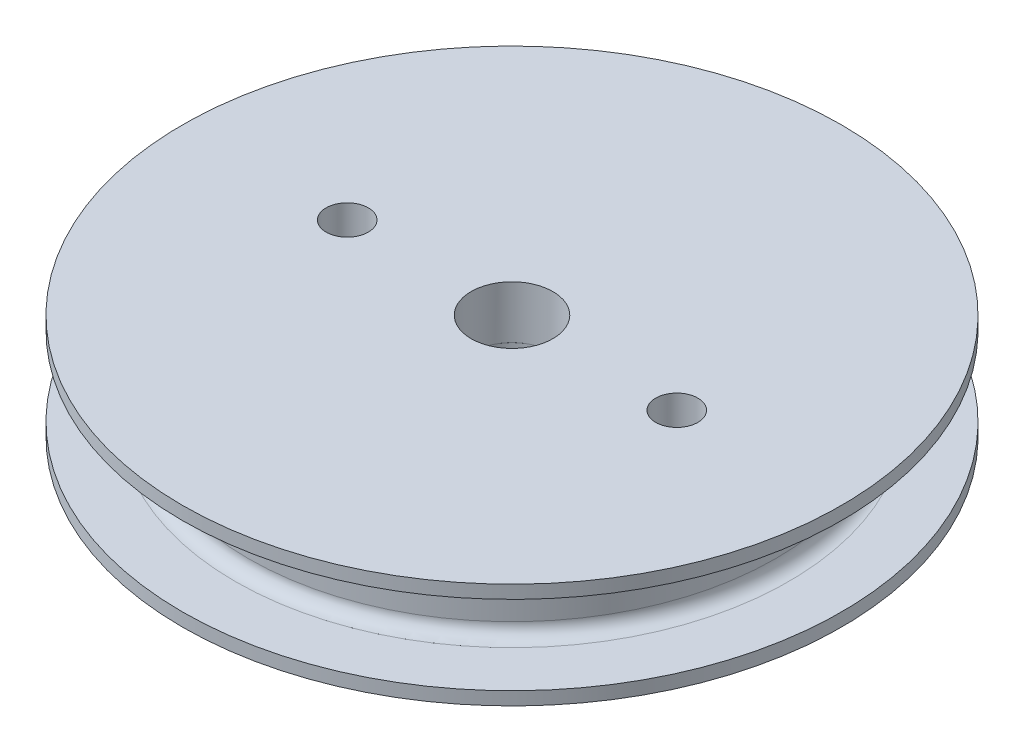
ISO-10303-21;
HEADER;
FILE_DESCRIPTION(('STEP AP214'),'2;1');
FILE_NAME('part.step','',(''),(''),'','','');
FILE_SCHEMA(('AUTOMOTIVE_DESIGN { 1 0 10303 214 1 1 1 1 }'));
ENDSEC;
DATA;
#1=APPLICATION_CONTEXT('core data for automotive mechanical design processes');
#2=APPLICATION_PROTOCOL_DEFINITION('international standard','automotive_design',2000,#1);
#3=PRODUCT_CONTEXT('',#1,'mechanical');
#4=PRODUCT('Part','Part','',(#3));
#5=PRODUCT_RELATED_PRODUCT_CATEGORY('part','',(#4));
#6=PRODUCT_DEFINITION_FORMATION('','',#4);
#7=PRODUCT_DEFINITION_CONTEXT('part definition',#1,'design');
#8=PRODUCT_DEFINITION('design','',#6,#7);
#9=PRODUCT_DEFINITION_SHAPE('','',#8);
#10=(LENGTH_UNIT() NAMED_UNIT(*) SI_UNIT(.MILLI.,.METRE.));
#11=(NAMED_UNIT(*) PLANE_ANGLE_UNIT() SI_UNIT($,.RADIAN.));
#12=(NAMED_UNIT(*) SI_UNIT($,.STERADIAN.) SOLID_ANGLE_UNIT());
#13=UNCERTAINTY_MEASURE_WITH_UNIT(LENGTH_MEASURE(1.E-05),#10,'distance_accuracy_value','');
#14=(GEOMETRIC_REPRESENTATION_CONTEXT(3) GLOBAL_UNCERTAINTY_ASSIGNED_CONTEXT((#13)) GLOBAL_UNIT_ASSIGNED_CONTEXT((#10,
#11,#12)) REPRESENTATION_CONTEXT('',''));
#15=CARTESIAN_POINT('',(0.,0.,0.));
#16=DIRECTION('',(0.,0.,1.));
#17=DIRECTION('',(1.,0.,0.));
#18=AXIS2_PLACEMENT_3D('',#15,#16,#17);
#19=CARTESIAN_POINT('',(25.,8.,0.));
#20=DIRECTION('',(0.,1.,0.));
#21=DIRECTION('',(0.,0.,-1.));
#22=AXIS2_PLACEMENT_3D('',#19,#20,#21);
#23=PLANE('',#22);
#24=CARTESIAN_POINT('',(12.5,8.,0.));
#25=DIRECTION('',(0.,-1.,0.));
#26=DIRECTION('',(0.,0.,-1.));
#27=AXIS2_PLACEMENT_3D('',#24,#25,#26);
#28=CIRCLE('',#27,1.6);
#29=CARTESIAN_POINT('',(12.5,8.,-1.6));
#30=VERTEX_POINT('',#29);
#31=EDGE_CURVE('E63',#30,#30,#28,.T.);
#32=ORIENTED_EDGE('',*,*,#31,.T.);
#33=EDGE_LOOP('',(#32));
#34=FACE_BOUND('',#33,.T.);
#35=CARTESIAN_POINT('',(-12.5,8.,0.));
#36=DIRECTION('',(0.,-1.,0.));
#37=DIRECTION('',(0.,0.,-1.));
#38=AXIS2_PLACEMENT_3D('',#35,#36,#37);
#39=CIRCLE('',#38,1.6);
#40=CARTESIAN_POINT('',(-12.5,8.,-1.6));
#41=VERTEX_POINT('',#40);
#42=EDGE_CURVE('E68',#41,#41,#39,.T.);
#43=ORIENTED_EDGE('',*,*,#42,.T.);
#44=EDGE_LOOP('',(#43));
#45=FACE_BOUND('',#44,.T.);
#46=CARTESIAN_POINT('',(0.,8.,0.));
#47=DIRECTION('',(0.,1.,0.));
#48=DIRECTION('',(0.,0.,1.));
#49=AXIS2_PLACEMENT_3D('',#46,#47,#48);
#50=CIRCLE('',#49,3.1);
#51=CARTESIAN_POINT('',(0.,8.,3.1));
#52=VERTEX_POINT('',#51);
#53=EDGE_CURVE('E60',#52,#52,#50,.T.);
#54=ORIENTED_EDGE('',*,*,#53,.F.);
#55=EDGE_LOOP('',(#54));
#56=FACE_BOUND('',#55,.T.);
#57=CARTESIAN_POINT('',(0.,8.,0.));
#58=DIRECTION('',(0.,-1.,0.));
#59=DIRECTION('',(0.,0.,-1.));
#60=AXIS2_PLACEMENT_3D('',#57,#58,#59);
#61=CIRCLE('',#60,25.);
#62=CARTESIAN_POINT('',(0.,8.,-25.));
#63=VERTEX_POINT('',#62);
#64=EDGE_CURVE('E11',#63,#63,#61,.T.);
#65=ORIENTED_EDGE('',*,*,#64,.F.);
#66=EDGE_LOOP('',(#65));
#67=FACE_BOUND('',#66,.T.);
#68=ADVANCED_FACE('F41',(#34,#45,#56,#67),#23,.T.);
#69=CARTESIAN_POINT('',(0.,8.,0.));
#70=DIRECTION('',(0.,1.,0.));
#71=DIRECTION('',(0.,0.,-1.));
#72=AXIS2_PLACEMENT_3D('',#69,#70,#71);
#73=CYLINDRICAL_SURFACE('',#72,25.);
#74=CARTESIAN_POINT('',(0.,7.,0.));
#75=DIRECTION('',(0.,-1.,0.));
#76=DIRECTION('',(0.,0.,-1.));
#77=AXIS2_PLACEMENT_3D('',#74,#75,#76);
#78=CIRCLE('',#77,25.);
#79=CARTESIAN_POINT('',(0.,7.,-25.));
#80=VERTEX_POINT('',#79);
#81=EDGE_CURVE('E48',#80,#80,#78,.T.);
#82=ORIENTED_EDGE('',*,*,#81,.F.);
#83=EDGE_LOOP('',(#82));
#84=FACE_BOUND('',#83,.T.);
#85=ORIENTED_EDGE('',*,*,#64,.T.);
#86=EDGE_LOOP('',(#85));
#87=FACE_BOUND('',#86,.T.);
#88=ADVANCED_FACE('F89',(#84,#87),#73,.T.);
#89=CARTESIAN_POINT('',(21.,7.,0.));
#90=DIRECTION('',(0.,-1.,0.));
#91=DIRECTION('',(0.,0.,1.));
#92=AXIS2_PLACEMENT_3D('',#89,#90,#91);
#93=PLANE('',#92);
#94=CARTESIAN_POINT('',(0.,7.,0.));
#95=DIRECTION('',(0.,-1.,0.));
#96=DIRECTION('',(0.,0.,-1.));
#97=AXIS2_PLACEMENT_3D('',#94,#95,#96);
#98=CIRCLE('',#97,21.);
#99=CARTESIAN_POINT('',(0.,7.,-21.));
#100=VERTEX_POINT('',#99);
#101=EDGE_CURVE('E53',#100,#100,#98,.T.);
#102=ORIENTED_EDGE('',*,*,#101,.F.);
#103=EDGE_LOOP('',(#102));
#104=FACE_BOUND('',#103,.T.);
#105=ORIENTED_EDGE('',*,*,#81,.T.);
#106=EDGE_LOOP('',(#105));
#107=FACE_BOUND('',#106,.T.);
#108=ADVANCED_FACE('F86',(#104,#107),#93,.T.);
#109=CARTESIAN_POINT('',(0.,6.,0.));
#110=DIRECTION('',(0.,1.,0.));
#111=DIRECTION('',(0.,0.,-1.));
#112=AXIS2_PLACEMENT_3D('',#109,#110,#111);
#113=TOROIDAL_SURFACE('',#112,21.,1.);
#114=CARTESIAN_POINT('',(0.,6.,0.));
#115=DIRECTION('',(0.,-1.,0.));
#116=DIRECTION('',(0.,0.,-1.));
#117=AXIS2_PLACEMENT_3D('',#114,#115,#116);
#118=CIRCLE('',#117,20.);
#119=CARTESIAN_POINT('',(0.,6.,-20.));
#120=VERTEX_POINT('',#119);
#121=EDGE_CURVE('E79',#120,#120,#118,.T.);
#122=ORIENTED_EDGE('',*,*,#121,.F.);
#123=EDGE_LOOP('',(#122));
#124=FACE_BOUND('',#123,.T.);
#125=ORIENTED_EDGE('',*,*,#101,.T.);
#126=EDGE_LOOP('',(#125));
#127=FACE_BOUND('',#126,.T.);
#128=ADVANCED_FACE('F84',(#124,#127),#113,.F.);
#129=CARTESIAN_POINT('',(0.,8.,0.));
#130=DIRECTION('',(0.,1.,0.));
#131=DIRECTION('',(0.,0.,-1.));
#132=AXIS2_PLACEMENT_3D('',#129,#130,#131);
#133=CYLINDRICAL_SURFACE('',#132,20.);
#134=CARTESIAN_POINT('',(0.,4.,0.));
#135=DIRECTION('',(0.,-1.,0.));
#136=DIRECTION('',(0.,0.,-1.));
#137=AXIS2_PLACEMENT_3D('',#134,#135,#136);
#138=CIRCLE('',#137,20.);
#139=CARTESIAN_POINT('',(0.,4.,-20.));
#140=VERTEX_POINT('',#139);
#141=EDGE_CURVE('E59',#140,#140,#138,.T.);
#142=ORIENTED_EDGE('',*,*,#141,.F.);
#143=EDGE_LOOP('',(#142));
#144=FACE_BOUND('',#143,.T.);
#145=ORIENTED_EDGE('',*,*,#121,.T.);
#146=EDGE_LOOP('',(#145));
#147=FACE_BOUND('',#146,.T.);
#148=ADVANCED_FACE('F101',(#144,#147),#133,.T.);
#149=CARTESIAN_POINT('',(0.,3.99999999999999,0.));
#150=DIRECTION('',(0.,-1.,0.));
#151=DIRECTION('',(0.,0.,1.));
#152=AXIS2_PLACEMENT_3D('',#149,#150,#151);
#153=PLANE('',#152);
#154=CARTESIAN_POINT('',(12.5,3.99999999999999,0.));
#155=DIRECTION('',(0.,-1.,0.));
#156=DIRECTION('',(0.,0.,-1.));
#157=AXIS2_PLACEMENT_3D('',#154,#155,#156);
#158=CIRCLE('',#157,1.6);
#159=CARTESIAN_POINT('',(12.5,3.99999999999999,-1.6));
#160=VERTEX_POINT('',#159);
#161=EDGE_CURVE('E44',#160,#160,#158,.T.);
#162=ORIENTED_EDGE('',*,*,#161,.F.);
#163=EDGE_LOOP('',(#162));
#164=FACE_BOUND('',#163,.T.);
#165=CARTESIAN_POINT('',(-12.5,3.99999999999999,0.));
#166=DIRECTION('',(0.,-1.,0.));
#167=DIRECTION('',(0.,0.,-1.));
#168=AXIS2_PLACEMENT_3D('',#165,#166,#167);
#169=CIRCLE('',#168,1.6);
#170=CARTESIAN_POINT('',(-12.5,3.99999999999999,-1.6));
#171=VERTEX_POINT('',#170);
#172=EDGE_CURVE('E61',#171,#171,#169,.T.);
#173=ORIENTED_EDGE('',*,*,#172,.F.);
#174=EDGE_LOOP('',(#173));
#175=FACE_BOUND('',#174,.T.);
#176=CARTESIAN_POINT('',(0.,3.99999999999999,0.));
#177=DIRECTION('',(0.,-1.,0.));
#178=DIRECTION('',(0.,0.,-1.));
#179=AXIS2_PLACEMENT_3D('',#176,#177,#178);
#180=CIRCLE('',#179,3.1);
#181=CARTESIAN_POINT('',(0.,3.99999999999999,-3.1));
#182=VERTEX_POINT('',#181);
#183=EDGE_CURVE('E57',#182,#182,#180,.T.);
#184=ORIENTED_EDGE('',*,*,#183,.F.);
#185=EDGE_LOOP('',(#184));
#186=FACE_BOUND('',#185,.T.);
#187=ORIENTED_EDGE('',*,*,#141,.T.);
#188=EDGE_LOOP('',(#187));
#189=FACE_BOUND('',#188,.T.);
#190=ADVANCED_FACE('F105',(#164,#175,#186,#189),#153,.T.);
#191=CARTESIAN_POINT('',(0.,0.,0.));
#192=DIRECTION('',(0.,1.,0.));
#193=DIRECTION('',(0.,0.,1.));
#194=AXIS2_PLACEMENT_3D('',#191,#192,#193);
#195=CYLINDRICAL_SURFACE('',#194,3.1);
#196=ORIENTED_EDGE('',*,*,#183,.T.);
#197=EDGE_LOOP('',(#196));
#198=FACE_BOUND('',#197,.T.);
#199=ORIENTED_EDGE('',*,*,#53,.T.);
#200=EDGE_LOOP('',(#199));
#201=FACE_BOUND('',#200,.T.);
#202=ADVANCED_FACE('F109',(#198,#201),#195,.F.);
#203=CARTESIAN_POINT('',(-12.5,8.,0.));
#204=DIRECTION('',(0.,-1.,0.));
#205=DIRECTION('',(0.,0.,-1.));
#206=AXIS2_PLACEMENT_3D('',#203,#204,#205);
#207=CYLINDRICAL_SURFACE('',#206,1.6);
#208=ORIENTED_EDGE('',*,*,#172,.T.);
#209=EDGE_LOOP('',(#208));
#210=FACE_BOUND('',#209,.T.);
#211=ORIENTED_EDGE('',*,*,#42,.F.);
#212=EDGE_LOOP('',(#211));
#213=FACE_BOUND('',#212,.T.);
#214=ADVANCED_FACE('F113',(#210,#213),#207,.F.);
#215=CARTESIAN_POINT('',(12.5,8.,0.));
#216=DIRECTION('',(0.,-1.,0.));
#217=DIRECTION('',(0.,0.,-1.));
#218=AXIS2_PLACEMENT_3D('',#215,#216,#217);
#219=CYLINDRICAL_SURFACE('',#218,1.6);
#220=ORIENTED_EDGE('',*,*,#161,.T.);
#221=EDGE_LOOP('',(#220));
#222=FACE_BOUND('',#221,.T.);
#223=ORIENTED_EDGE('',*,*,#31,.F.);
#224=EDGE_LOOP('',(#223));
#225=FACE_BOUND('',#224,.T.);
#226=ADVANCED_FACE('F117',(#222,#225),#219,.F.);
#227=CLOSED_SHELL('',(#68,#88,#108,#128,#148,#190,#202,#214,#226));
#228=MANIFOLD_SOLID_BREP('B2',#227);
#229=CARTESIAN_POINT('',(25.,0.,0.));
#230=DIRECTION('',(0.,-1.,0.));
#231=DIRECTION('',(0.,0.,-1.));
#232=AXIS2_PLACEMENT_3D('',#229,#230,#231);
#233=PLANE('',#232);
#234=CARTESIAN_POINT('',(12.5,0.,0.));
#235=DIRECTION('',(0.,-1.,0.));
#236=DIRECTION('',(0.,0.,-1.));
#237=AXIS2_PLACEMENT_3D('',#234,#235,#236);
#238=CIRCLE('',#237,1.6);
#239=CARTESIAN_POINT('',(12.5,0.,-1.6));
#240=VERTEX_POINT('',#239);
#241=EDGE_CURVE('E212',#240,#240,#238,.T.);
#242=ORIENTED_EDGE('',*,*,#241,.F.);
#243=EDGE_LOOP('',(#242));
#244=FACE_BOUND('',#243,.T.);
#245=CARTESIAN_POINT('',(-12.5,0.,0.));
#246=DIRECTION('',(0.,-1.,0.));
#247=DIRECTION('',(0.,0.,-1.));
#248=AXIS2_PLACEMENT_3D('',#245,#246,#247);
#249=CIRCLE('',#248,1.6);
#250=CARTESIAN_POINT('',(-12.5,0.,-1.6));
#251=VERTEX_POINT('',#250);
#252=EDGE_CURVE('E217',#251,#251,#249,.T.);
#253=ORIENTED_EDGE('',*,*,#252,.F.);
#254=EDGE_LOOP('',(#253));
#255=FACE_BOUND('',#254,.T.);
#256=CARTESIAN_POINT('',(0.,0.,0.));
#257=DIRECTION('',(0.,1.,0.));
#258=DIRECTION('',(0.,0.,1.));
#259=AXIS2_PLACEMENT_3D('',#256,#257,#258);
#260=CIRCLE('',#259,3.1);
#261=CARTESIAN_POINT('',(0.,0.,3.1));
#262=VERTEX_POINT('',#261);
#263=EDGE_CURVE('E209',#262,#262,#260,.T.);
#264=ORIENTED_EDGE('',*,*,#263,.T.);
#265=EDGE_LOOP('',(#264));
#266=FACE_BOUND('',#265,.T.);
#267=CARTESIAN_POINT('',(0.,0.,0.));
#268=DIRECTION('',(0.,-1.,0.));
#269=DIRECTION('',(0.,0.,-1.));
#270=AXIS2_PLACEMENT_3D('',#267,#268,#269);
#271=CIRCLE('',#270,25.);
#272=CARTESIAN_POINT('',(0.,0.,-25.));
#273=VERTEX_POINT('',#272);
#274=EDGE_CURVE('E40',#273,#273,#271,.T.);
#275=ORIENTED_EDGE('',*,*,#274,.T.);
#276=EDGE_LOOP('',(#275));
#277=FACE_BOUND('',#276,.T.);
#278=ADVANCED_FACE('F190',(#244,#255,#266,#277),#233,.T.);
#279=CARTESIAN_POINT('',(0.,0.,0.));
#280=DIRECTION('',(0.,-1.,0.));
#281=DIRECTION('',(0.,0.,-1.));
#282=AXIS2_PLACEMENT_3D('',#279,#280,#281);
#283=CYLINDRICAL_SURFACE('',#282,25.);
#284=CARTESIAN_POINT('',(0.,0.999999999999998,0.));
#285=DIRECTION('',(0.,-1.,0.));
#286=DIRECTION('',(0.,0.,-1.));
#287=AXIS2_PLACEMENT_3D('',#284,#285,#286);
#288=CIRCLE('',#287,25.);
#289=CARTESIAN_POINT('',(0.,0.999999999999998,-25.));
#290=VERTEX_POINT('',#289);
#291=EDGE_CURVE('E197',#290,#290,#288,.T.);
#292=ORIENTED_EDGE('',*,*,#291,.T.);
#293=EDGE_LOOP('',(#292));
#294=FACE_BOUND('',#293,.T.);
#295=ORIENTED_EDGE('',*,*,#274,.F.);
#296=EDGE_LOOP('',(#295));
#297=FACE_BOUND('',#296,.T.);
#298=ADVANCED_FACE('F248',(#294,#297),#283,.T.);
#299=CARTESIAN_POINT('',(21.,0.999999999999998,0.));
#300=DIRECTION('',(0.,1.,0.));
#301=DIRECTION('',(0.,0.,1.));
#302=AXIS2_PLACEMENT_3D('',#299,#300,#301);
#303=PLANE('',#302);
#304=CARTESIAN_POINT('',(0.,0.999999999999997,0.));
#305=DIRECTION('',(0.,-1.,0.));
#306=DIRECTION('',(0.,0.,-1.));
#307=AXIS2_PLACEMENT_3D('',#304,#305,#306);
#308=CIRCLE('',#307,21.);
#309=CARTESIAN_POINT('',(0.,0.999999999999997,-21.));
#310=VERTEX_POINT('',#309);
#311=EDGE_CURVE('E202',#310,#310,#308,.T.);
#312=ORIENTED_EDGE('',*,*,#311,.T.);
#313=EDGE_LOOP('',(#312));
#314=FACE_BOUND('',#313,.T.);
#315=ORIENTED_EDGE('',*,*,#291,.F.);
#316=EDGE_LOOP('',(#315));
#317=FACE_BOUND('',#316,.T.);
#318=ADVANCED_FACE('F233',(#314,#317),#303,.T.);
#319=CARTESIAN_POINT('',(0.,2.,0.));
#320=DIRECTION('',(0.,-1.,0.));
#321=DIRECTION('',(0.,0.,-1.));
#322=AXIS2_PLACEMENT_3D('',#319,#320,#321);
#323=TOROIDAL_SURFACE('',#322,21.,1.);
#324=CARTESIAN_POINT('',(0.,2.,0.));
#325=DIRECTION('',(0.,-1.,0.));
#326=DIRECTION('',(0.,0.,-1.));
#327=AXIS2_PLACEMENT_3D('',#324,#325,#326);
#328=CIRCLE('',#327,20.);
#329=CARTESIAN_POINT('',(0.,2.,-20.));
#330=VERTEX_POINT('',#329);
#331=EDGE_CURVE('E228',#330,#330,#328,.T.);
#332=ORIENTED_EDGE('',*,*,#331,.T.);
#333=EDGE_LOOP('',(#332));
#334=FACE_BOUND('',#333,.T.);
#335=ORIENTED_EDGE('',*,*,#311,.F.);
#336=EDGE_LOOP('',(#335));
#337=FACE_BOUND('',#336,.T.);
#338=ADVANCED_FACE('F236',(#334,#337),#323,.F.);
#339=CARTESIAN_POINT('',(0.,0.,0.));
#340=DIRECTION('',(0.,-1.,0.));
#341=DIRECTION('',(0.,0.,-1.));
#342=AXIS2_PLACEMENT_3D('',#339,#340,#341);
#343=CYLINDRICAL_SURFACE('',#342,20.);
#344=CARTESIAN_POINT('',(0.,4.,0.));
#345=DIRECTION('',(0.,-1.,0.));
#346=DIRECTION('',(0.,0.,-1.));
#347=AXIS2_PLACEMENT_3D('',#344,#345,#346);
#348=CIRCLE('',#347,20.);
#349=CARTESIAN_POINT('',(0.,4.,-20.));
#350=VERTEX_POINT('',#349);
#351=EDGE_CURVE('E208',#350,#350,#348,.T.);
#352=ORIENTED_EDGE('',*,*,#351,.T.);
#353=EDGE_LOOP('',(#352));
#354=FACE_BOUND('',#353,.T.);
#355=ORIENTED_EDGE('',*,*,#331,.F.);
#356=EDGE_LOOP('',(#355));
#357=FACE_BOUND('',#356,.T.);
#358=ADVANCED_FACE('F238',(#354,#357),#343,.T.);
#359=CARTESIAN_POINT('',(0.,4.,0.));
#360=DIRECTION('',(0.,1.,0.));
#361=DIRECTION('',(0.,0.,1.));
#362=AXIS2_PLACEMENT_3D('',#359,#360,#361);
#363=PLANE('',#362);
#364=CARTESIAN_POINT('',(12.5,4.,0.));
#365=DIRECTION('',(0.,1.,0.));
#366=DIRECTION('',(0.,0.,1.));
#367=AXIS2_PLACEMENT_3D('',#364,#365,#366);
#368=CIRCLE('',#367,1.6);
#369=CARTESIAN_POINT('',(12.5,4.,1.6));
#370=VERTEX_POINT('',#369);
#371=EDGE_CURVE('E193',#370,#370,#368,.T.);
#372=ORIENTED_EDGE('',*,*,#371,.F.);
#373=EDGE_LOOP('',(#372));
#374=FACE_BOUND('',#373,.T.);
#375=CARTESIAN_POINT('',(-12.5,4.,0.));
#376=DIRECTION('',(0.,1.,0.));
#377=DIRECTION('',(0.,0.,1.));
#378=AXIS2_PLACEMENT_3D('',#375,#376,#377);
#379=CIRCLE('',#378,1.6);
#380=CARTESIAN_POINT('',(-12.5,4.,1.6));
#381=VERTEX_POINT('',#380);
#382=EDGE_CURVE('E210',#381,#381,#379,.T.);
#383=ORIENTED_EDGE('',*,*,#382,.F.);
#384=EDGE_LOOP('',(#383));
#385=FACE_BOUND('',#384,.T.);
#386=CARTESIAN_POINT('',(0.,4.,0.));
#387=DIRECTION('',(0.,1.,0.));
#388=DIRECTION('',(0.,0.,1.));
#389=AXIS2_PLACEMENT_3D('',#386,#387,#388);
#390=CIRCLE('',#389,3.1);
#391=CARTESIAN_POINT('',(0.,4.,3.1));
#392=VERTEX_POINT('',#391);
#393=EDGE_CURVE('E206',#392,#392,#390,.T.);
#394=ORIENTED_EDGE('',*,*,#393,.F.);
#395=EDGE_LOOP('',(#394));
#396=FACE_BOUND('',#395,.T.);
#397=ORIENTED_EDGE('',*,*,#351,.F.);
#398=EDGE_LOOP('',(#397));
#399=FACE_BOUND('',#398,.T.);
#400=ADVANCED_FACE('F245',(#374,#385,#396,#399),#363,.T.);
#401=CARTESIAN_POINT('',(0.,0.,0.));
#402=DIRECTION('',(0.,1.,0.));
#403=DIRECTION('',(0.,0.,1.));
#404=AXIS2_PLACEMENT_3D('',#401,#402,#403);
#405=CYLINDRICAL_SURFACE('',#404,3.1);
#406=ORIENTED_EDGE('',*,*,#393,.T.);
#407=EDGE_LOOP('',(#406));
#408=FACE_BOUND('',#407,.T.);
#409=ORIENTED_EDGE('',*,*,#263,.F.);
#410=EDGE_LOOP('',(#409));
#411=FACE_BOUND('',#410,.T.);
#412=ADVANCED_FACE('F263',(#408,#411),#405,.F.);
#413=CARTESIAN_POINT('',(-12.5,8.,0.));
#414=DIRECTION('',(0.,-1.,0.));
#415=DIRECTION('',(0.,0.,-1.));
#416=AXIS2_PLACEMENT_3D('',#413,#414,#415);
#417=CYLINDRICAL_SURFACE('',#416,1.6);
#418=ORIENTED_EDGE('',*,*,#382,.T.);
#419=EDGE_LOOP('',(#418));
#420=FACE_BOUND('',#419,.T.);
#421=ORIENTED_EDGE('',*,*,#252,.T.);
#422=EDGE_LOOP('',(#421));
#423=FACE_BOUND('',#422,.T.);
#424=ADVANCED_FACE('F265',(#420,#423),#417,.F.);
#425=CARTESIAN_POINT('',(12.5,8.,0.));
#426=DIRECTION('',(0.,-1.,0.));
#427=DIRECTION('',(0.,0.,-1.));
#428=AXIS2_PLACEMENT_3D('',#425,#426,#427);
#429=CYLINDRICAL_SURFACE('',#428,1.6);
#430=ORIENTED_EDGE('',*,*,#371,.T.);
#431=EDGE_LOOP('',(#430));
#432=FACE_BOUND('',#431,.T.);
#433=ORIENTED_EDGE('',*,*,#241,.T.);
#434=EDGE_LOOP('',(#433));
#435=FACE_BOUND('',#434,.T.);
#436=ADVANCED_FACE('F271',(#432,#435),#429,.F.);
#437=CLOSED_SHELL('',(#278,#298,#318,#338,#358,#400,#412,#424,#436));
#438=MANIFOLD_SOLID_BREP('B6',#437);
#439=ADVANCED_BREP_SHAPE_REPRESENTATION('',(#18,#228,#438),#14);
#440=SHAPE_DEFINITION_REPRESENTATION(#9,#439);
ENDSEC;
END-ISO-10303-21;
